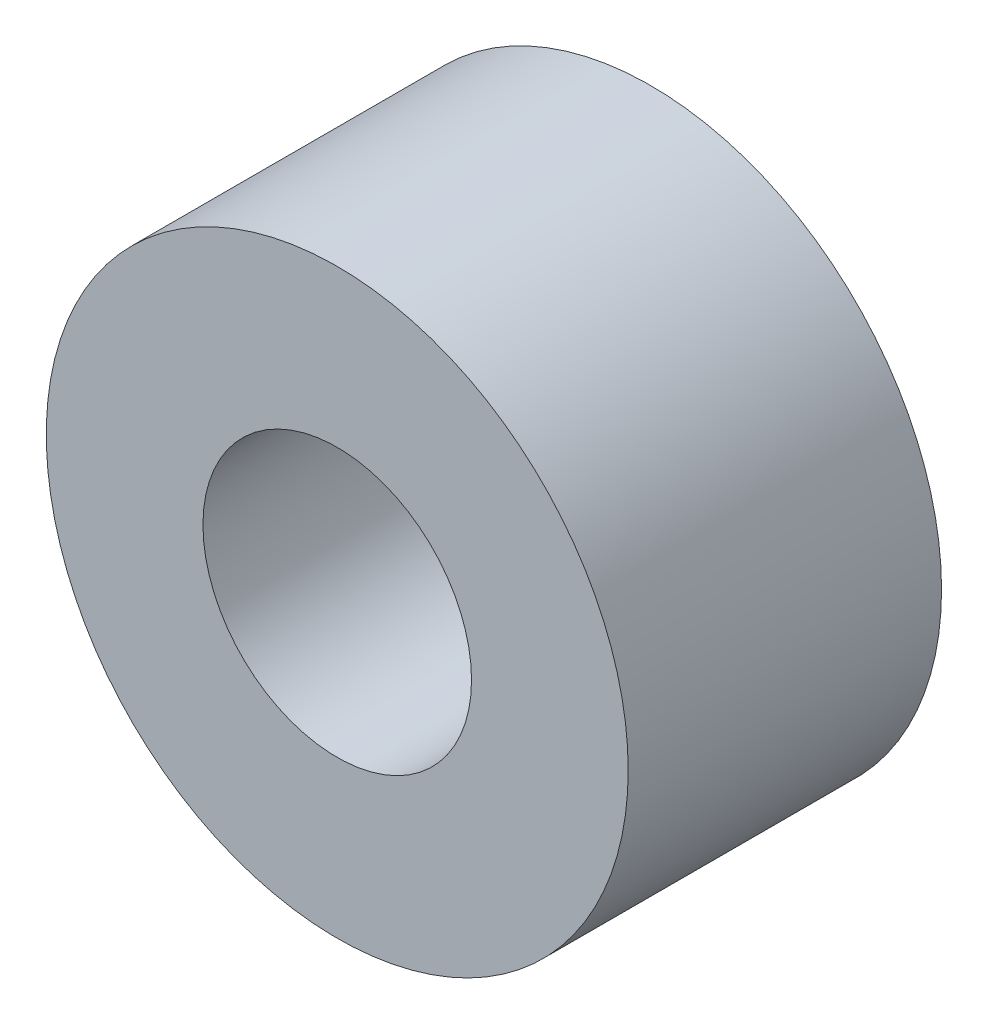
ISO-10303-21;
HEADER;
FILE_DESCRIPTION(('STEP AP214'),'2;1');
FILE_NAME('part.step','',(''),(''),'','','');
FILE_SCHEMA(('AUTOMOTIVE_DESIGN { 1 0 10303 214 1 1 1 1 }'));
ENDSEC;
DATA;
#1=APPLICATION_CONTEXT('core data for automotive mechanical design processes');
#2=APPLICATION_PROTOCOL_DEFINITION('international standard','automotive_design',2000,#1);
#3=PRODUCT_CONTEXT('',#1,'mechanical');
#4=PRODUCT('Part','Part','',(#3));
#5=PRODUCT_RELATED_PRODUCT_CATEGORY('part','',(#4));
#6=PRODUCT_DEFINITION_FORMATION('','',#4);
#7=PRODUCT_DEFINITION_CONTEXT('part definition',#1,'design');
#8=PRODUCT_DEFINITION('design','',#6,#7);
#9=PRODUCT_DEFINITION_SHAPE('','',#8);
#10=(LENGTH_UNIT() NAMED_UNIT(*) SI_UNIT(.MILLI.,.METRE.));
#11=(NAMED_UNIT(*) PLANE_ANGLE_UNIT() SI_UNIT($,.RADIAN.));
#12=(NAMED_UNIT(*) SI_UNIT($,.STERADIAN.) SOLID_ANGLE_UNIT());
#13=UNCERTAINTY_MEASURE_WITH_UNIT(LENGTH_MEASURE(1.E-05),#10,'distance_accuracy_value','');
#14=(GEOMETRIC_REPRESENTATION_CONTEXT(3) GLOBAL_UNCERTAINTY_ASSIGNED_CONTEXT((#13)) GLOBAL_UNIT_ASSIGNED_CONTEXT((#10,
#11,#12)) REPRESENTATION_CONTEXT('',''));
#15=CARTESIAN_POINT('',(0.,0.,0.));
#16=DIRECTION('',(0.,0.,1.));
#17=DIRECTION('',(1.,0.,0.));
#18=AXIS2_PLACEMENT_3D('',#15,#16,#17);
#19=CARTESIAN_POINT('',(0.,0.,7.));
#20=DIRECTION('',(0.,0.,1.));
#21=DIRECTION('',(1.,0.,0.));
#22=AXIS2_PLACEMENT_3D('',#19,#20,#21);
#23=PLANE('',#22);
#24=CARTESIAN_POINT('',(0.,0.,7.));
#25=DIRECTION('',(0.,0.,1.));
#26=DIRECTION('',(1.,0.,0.));
#27=AXIS2_PLACEMENT_3D('',#24,#25,#26);
#28=CIRCLE('',#27,6.5);
#29=CARTESIAN_POINT('',(6.5,0.,7.));
#30=VERTEX_POINT('',#29);
#31=EDGE_CURVE('E10',#30,#30,#28,.T.);
#32=ORIENTED_EDGE('',*,*,#31,.T.);
#33=EDGE_LOOP('',(#32));
#34=FACE_BOUND('',#33,.T.);
#35=CARTESIAN_POINT('',(0.,0.,7.));
#36=DIRECTION('',(0.,0.,1.));
#37=DIRECTION('',(1.,0.,0.));
#38=AXIS2_PLACEMENT_3D('',#35,#36,#37);
#39=CIRCLE('',#38,3.);
#40=CARTESIAN_POINT('',(3.,0.,7.));
#41=VERTEX_POINT('',#40);
#42=EDGE_CURVE('E50',#41,#41,#39,.T.);
#43=ORIENTED_EDGE('',*,*,#42,.F.);
#44=EDGE_LOOP('',(#43));
#45=FACE_BOUND('',#44,.T.);
#46=ADVANCED_FACE('F39',(#34,#45),#23,.T.);
#47=CARTESIAN_POINT('',(0.,0.,0.));
#48=DIRECTION('',(0.,0.,1.));
#49=DIRECTION('',(1.,0.,0.));
#50=AXIS2_PLACEMENT_3D('',#47,#48,#49);
#51=PLANE('',#50);
#52=CARTESIAN_POINT('',(0.,0.,0.));
#53=DIRECTION('',(0.,0.,1.));
#54=DIRECTION('',(1.,0.,0.));
#55=AXIS2_PLACEMENT_3D('',#52,#53,#54);
#56=CIRCLE('',#55,6.5);
#57=CARTESIAN_POINT('',(6.5,0.,0.));
#58=VERTEX_POINT('',#57);
#59=EDGE_CURVE('E43',#58,#58,#56,.T.);
#60=ORIENTED_EDGE('',*,*,#59,.F.);
#61=EDGE_LOOP('',(#60));
#62=FACE_BOUND('',#61,.T.);
#63=CARTESIAN_POINT('',(0.,0.,0.));
#64=DIRECTION('',(0.,0.,1.));
#65=DIRECTION('',(1.,0.,0.));
#66=AXIS2_PLACEMENT_3D('',#63,#64,#65);
#67=CIRCLE('',#66,3.);
#68=CARTESIAN_POINT('',(3.,0.,0.));
#69=VERTEX_POINT('',#68);
#70=EDGE_CURVE('E52',#69,#69,#67,.T.);
#71=ORIENTED_EDGE('',*,*,#70,.T.);
#72=EDGE_LOOP('',(#71));
#73=FACE_BOUND('',#72,.T.);
#74=ADVANCED_FACE('F62',(#62,#73),#51,.F.);
#75=CARTESIAN_POINT('',(0.,0.,7.));
#76=DIRECTION('',(0.,0.,-1.));
#77=DIRECTION('',(-1.,0.,0.));
#78=AXIS2_PLACEMENT_3D('',#75,#76,#77);
#79=CYLINDRICAL_SURFACE('',#78,6.5);
#80=ORIENTED_EDGE('',*,*,#31,.F.);
#81=EDGE_LOOP('',(#80));
#82=FACE_BOUND('',#81,.T.);
#83=ORIENTED_EDGE('',*,*,#59,.T.);
#84=EDGE_LOOP('',(#83));
#85=FACE_BOUND('',#84,.T.);
#86=ADVANCED_FACE('F41',(#82,#85),#79,.T.);
#87=CARTESIAN_POINT('',(0.,0.,7.));
#88=DIRECTION('',(0.,0.,-1.));
#89=DIRECTION('',(-1.,0.,0.));
#90=AXIS2_PLACEMENT_3D('',#87,#88,#89);
#91=CYLINDRICAL_SURFACE('',#90,3.);
#92=ORIENTED_EDGE('',*,*,#42,.T.);
#93=EDGE_LOOP('',(#92));
#94=FACE_BOUND('',#93,.T.);
#95=ORIENTED_EDGE('',*,*,#70,.F.);
#96=EDGE_LOOP('',(#95));
#97=FACE_BOUND('',#96,.T.);
#98=ADVANCED_FACE('F58',(#94,#97),#91,.F.);
#99=CLOSED_SHELL('',(#46,#74,#86,#98));
#100=MANIFOLD_SOLID_BREP('B2',#99);
#101=ADVANCED_BREP_SHAPE_REPRESENTATION('',(#18,#100),#14);
#102=SHAPE_DEFINITION_REPRESENTATION(#9,#101);
ENDSEC;
END-ISO-10303-21;
